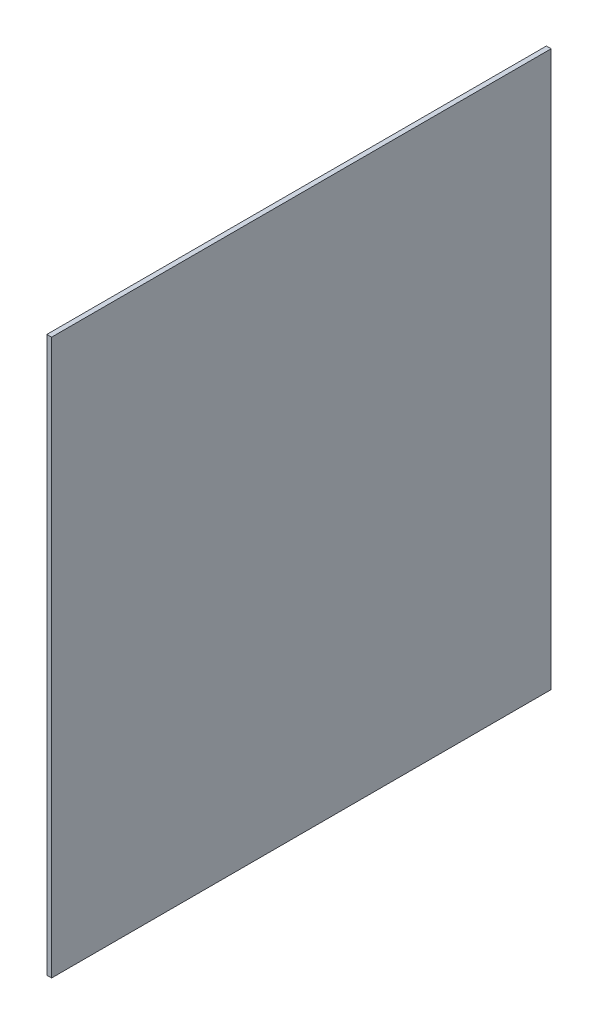
ISO-10303-21;
HEADER;
FILE_DESCRIPTION(('STEP AP214'),'2;1');
FILE_NAME('part.step','',(''),(''),'','','');
FILE_SCHEMA(('AUTOMOTIVE_DESIGN { 1 0 10303 214 1 1 1 1 }'));
ENDSEC;
DATA;
#1=APPLICATION_CONTEXT('core data for automotive mechanical design processes');
#2=APPLICATION_PROTOCOL_DEFINITION('international standard','automotive_design',2000,#1);
#3=PRODUCT_CONTEXT('',#1,'mechanical');
#4=PRODUCT('Part','Part','',(#3));
#5=PRODUCT_RELATED_PRODUCT_CATEGORY('part','',(#4));
#6=PRODUCT_DEFINITION_FORMATION('','',#4);
#7=PRODUCT_DEFINITION_CONTEXT('part definition',#1,'design');
#8=PRODUCT_DEFINITION('design','',#6,#7);
#9=PRODUCT_DEFINITION_SHAPE('','',#8);
#10=(LENGTH_UNIT() NAMED_UNIT(*) SI_UNIT(.MILLI.,.METRE.));
#11=(NAMED_UNIT(*) PLANE_ANGLE_UNIT() SI_UNIT($,.RADIAN.));
#12=(NAMED_UNIT(*) SI_UNIT($,.STERADIAN.) SOLID_ANGLE_UNIT());
#13=UNCERTAINTY_MEASURE_WITH_UNIT(LENGTH_MEASURE(1.E-05),#10,'distance_accuracy_value','');
#14=(GEOMETRIC_REPRESENTATION_CONTEXT(3) GLOBAL_UNCERTAINTY_ASSIGNED_CONTEXT((#13)) GLOBAL_UNIT_ASSIGNED_CONTEXT((#10,
#11,#12)) REPRESENTATION_CONTEXT('',''));
#15=CARTESIAN_POINT('',(0.,0.,0.));
#16=DIRECTION('',(0.,0.,1.));
#17=DIRECTION('',(1.,0.,0.));
#18=AXIS2_PLACEMENT_3D('',#15,#16,#17);
#19=CARTESIAN_POINT('',(3.,0.,0.));
#20=DIRECTION('',(0.,0.,-1.));
#21=DIRECTION('',(-1.,0.,0.));
#22=AXIS2_PLACEMENT_3D('',#19,#20,#21);
#23=PLANE('',#22);
#24=DIRECTION('',(0.,-1.,0.));
#25=VECTOR('',#24,1.);
#26=CARTESIAN_POINT('',(0.,0.,0.));
#27=LINE('',#26,#25);
#28=CARTESIAN_POINT('',(0.,350.,0.));
#29=VERTEX_POINT('',#28);
#30=CARTESIAN_POINT('',(0.,0.,0.));
#31=VERTEX_POINT('',#30);
#32=EDGE_CURVE('E98',#29,#31,#27,.T.);
#33=ORIENTED_EDGE('',*,*,#32,.T.);
#34=DIRECTION('',(-1.,0.,0.));
#35=VECTOR('',#34,1.);
#36=CARTESIAN_POINT('',(3.,0.,0.));
#37=LINE('',#36,#35);
#38=CARTESIAN_POINT('',(3.,0.,0.));
#39=VERTEX_POINT('',#38);
#40=EDGE_CURVE('E11',#39,#31,#37,.T.);
#41=ORIENTED_EDGE('',*,*,#40,.F.);
#42=DIRECTION('',(0.,-1.,0.));
#43=VECTOR('',#42,1.);
#44=CARTESIAN_POINT('',(3.,0.,0.));
#45=LINE('',#44,#43);
#46=CARTESIAN_POINT('',(3.,350.,0.));
#47=VERTEX_POINT('',#46);
#48=EDGE_CURVE('E86',#47,#39,#45,.T.);
#49=ORIENTED_EDGE('',*,*,#48,.F.);
#50=DIRECTION('',(-1.,0.,0.));
#51=VECTOR('',#50,1.);
#52=CARTESIAN_POINT('',(3.,350.,0.));
#53=LINE('',#52,#51);
#54=EDGE_CURVE('E94',#47,#29,#53,.T.);
#55=ORIENTED_EDGE('',*,*,#54,.T.);
#56=EDGE_LOOP('',(#33,#41,#49,#55));
#57=FACE_BOUND('',#56,.T.);
#58=ADVANCED_FACE('F35',(#57),#23,.F.);
#59=CARTESIAN_POINT('',(3.,0.,0.));
#60=DIRECTION('',(0.,1.,0.));
#61=DIRECTION('',(0.,0.,1.));
#62=AXIS2_PLACEMENT_3D('',#59,#60,#61);
#63=PLANE('',#62);
#64=DIRECTION('',(0.,0.,-1.));
#65=VECTOR('',#64,1.);
#66=CARTESIAN_POINT('',(0.,0.,0.));
#67=LINE('',#66,#65);
#68=CARTESIAN_POINT('',(0.,0.,-315.));
#69=VERTEX_POINT('',#68);
#70=EDGE_CURVE('E90',#31,#69,#67,.T.);
#71=ORIENTED_EDGE('',*,*,#70,.T.);
#72=DIRECTION('',(-1.,0.,0.));
#73=VECTOR('',#72,1.);
#74=CARTESIAN_POINT('',(3.,0.,-315.));
#75=LINE('',#74,#73);
#76=CARTESIAN_POINT('',(3.,0.,-315.));
#77=VERTEX_POINT('',#76);
#78=EDGE_CURVE('E43',#77,#69,#75,.T.);
#79=ORIENTED_EDGE('',*,*,#78,.F.);
#80=DIRECTION('',(0.,0.,-1.));
#81=VECTOR('',#80,1.);
#82=CARTESIAN_POINT('',(3.,0.,0.));
#83=LINE('',#82,#81);
#84=EDGE_CURVE('E81',#39,#77,#83,.T.);
#85=ORIENTED_EDGE('',*,*,#84,.F.);
#86=ORIENTED_EDGE('',*,*,#40,.T.);
#87=EDGE_LOOP('',(#71,#79,#85,#86));
#88=FACE_BOUND('',#87,.T.);
#89=ADVANCED_FACE('F89',(#88),#63,.F.);
#90=CARTESIAN_POINT('',(3.,0.,-315.));
#91=DIRECTION('',(0.,0.,1.));
#92=DIRECTION('',(1.,0.,0.));
#93=AXIS2_PLACEMENT_3D('',#90,#91,#92);
#94=PLANE('',#93);
#95=DIRECTION('',(0.,1.,0.));
#96=VECTOR('',#95,1.);
#97=CARTESIAN_POINT('',(0.,0.,-315.));
#98=LINE('',#97,#96);
#99=CARTESIAN_POINT('',(0.,350.,-315.));
#100=VERTEX_POINT('',#99);
#101=EDGE_CURVE('E68',#69,#100,#98,.T.);
#102=ORIENTED_EDGE('',*,*,#101,.T.);
#103=DIRECTION('',(-1.,0.,0.));
#104=VECTOR('',#103,1.);
#105=CARTESIAN_POINT('',(3.,350.,-315.));
#106=LINE('',#105,#104);
#107=CARTESIAN_POINT('',(3.,350.,-315.));
#108=VERTEX_POINT('',#107);
#109=EDGE_CURVE('E91',#108,#100,#106,.T.);
#110=ORIENTED_EDGE('',*,*,#109,.F.);
#111=DIRECTION('',(0.,1.,0.));
#112=VECTOR('',#111,1.);
#113=CARTESIAN_POINT('',(3.,0.,-315.));
#114=LINE('',#113,#112);
#115=EDGE_CURVE('E84',#77,#108,#114,.T.);
#116=ORIENTED_EDGE('',*,*,#115,.F.);
#117=ORIENTED_EDGE('',*,*,#78,.T.);
#118=EDGE_LOOP('',(#102,#110,#116,#117));
#119=FACE_BOUND('',#118,.T.);
#120=ADVANCED_FACE('F92',(#119),#94,.F.);
#121=CARTESIAN_POINT('',(3.,350.,0.));
#122=DIRECTION('',(0.,-1.,0.));
#123=DIRECTION('',(0.,0.,-1.));
#124=AXIS2_PLACEMENT_3D('',#121,#122,#123);
#125=PLANE('',#124);
#126=DIRECTION('',(0.,0.,1.));
#127=VECTOR('',#126,1.);
#128=CARTESIAN_POINT('',(0.,350.,0.));
#129=LINE('',#128,#127);
#130=EDGE_CURVE('E74',#100,#29,#129,.T.);
#131=ORIENTED_EDGE('',*,*,#130,.T.);
#132=ORIENTED_EDGE('',*,*,#54,.F.);
#133=DIRECTION('',(0.,0.,1.));
#134=VECTOR('',#133,1.);
#135=CARTESIAN_POINT('',(3.,350.,0.));
#136=LINE('',#135,#134);
#137=EDGE_CURVE('E51',#108,#47,#136,.T.);
#138=ORIENTED_EDGE('',*,*,#137,.F.);
#139=ORIENTED_EDGE('',*,*,#109,.T.);
#140=EDGE_LOOP('',(#131,#132,#138,#139));
#141=FACE_BOUND('',#140,.T.);
#142=ADVANCED_FACE('F105',(#141),#125,.F.);
#143=CARTESIAN_POINT('',(3.,0.,0.));
#144=DIRECTION('',(-1.,0.,0.));
#145=DIRECTION('',(0.,0.,1.));
#146=AXIS2_PLACEMENT_3D('',#143,#144,#145);
#147=PLANE('',#146);
#148=ORIENTED_EDGE('',*,*,#48,.T.);
#149=ORIENTED_EDGE('',*,*,#84,.T.);
#150=ORIENTED_EDGE('',*,*,#115,.T.);
#151=ORIENTED_EDGE('',*,*,#137,.T.);
#152=EDGE_LOOP('',(#148,#149,#150,#151));
#153=FACE_BOUND('',#152,.T.);
#154=ADVANCED_FACE('F82',(#153),#147,.F.);
#155=CARTESIAN_POINT('',(0.,0.,0.));
#156=DIRECTION('',(-1.,0.,0.));
#157=DIRECTION('',(0.,0.,1.));
#158=AXIS2_PLACEMENT_3D('',#155,#156,#157);
#159=PLANE('',#158);
#160=ORIENTED_EDGE('',*,*,#32,.F.);
#161=ORIENTED_EDGE('',*,*,#130,.F.);
#162=ORIENTED_EDGE('',*,*,#101,.F.);
#163=ORIENTED_EDGE('',*,*,#70,.F.);
#164=EDGE_LOOP('',(#160,#161,#162,#163));
#165=FACE_BOUND('',#164,.T.);
#166=ADVANCED_FACE('F108',(#165),#159,.T.);
#167=CLOSED_SHELL('',(#58,#89,#120,#142,#154,#166));
#168=MANIFOLD_SOLID_BREP('B2',#167);
#169=ADVANCED_BREP_SHAPE_REPRESENTATION('',(#18,#168),#14);
#170=SHAPE_DEFINITION_REPRESENTATION(#9,#169);
ENDSEC;
END-ISO-10303-21;
